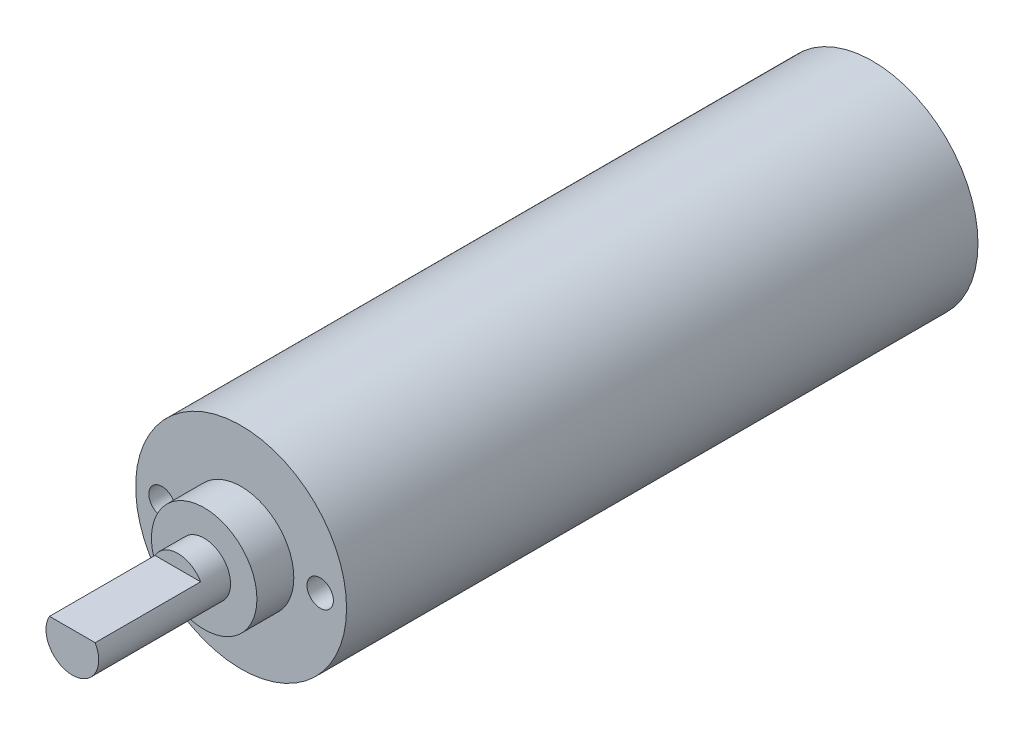
ISO-10303-21;
HEADER;
FILE_DESCRIPTION(('STEP AP214'),'2;1');
FILE_NAME('part.step','',(''),(''),'','','');
FILE_SCHEMA(('AUTOMOTIVE_DESIGN { 1 0 10303 214 1 1 1 1 }'));
ENDSEC;
DATA;
#1=APPLICATION_CONTEXT('core data for automotive mechanical design processes');
#2=APPLICATION_PROTOCOL_DEFINITION('international standard','automotive_design',2000,#1);
#3=PRODUCT_CONTEXT('',#1,'mechanical');
#4=PRODUCT('Part','Part','',(#3));
#5=PRODUCT_RELATED_PRODUCT_CATEGORY('part','',(#4));
#6=PRODUCT_DEFINITION_FORMATION('','',#4);
#7=PRODUCT_DEFINITION_CONTEXT('part definition',#1,'design');
#8=PRODUCT_DEFINITION('design','',#6,#7);
#9=PRODUCT_DEFINITION_SHAPE('','',#8);
#10=(LENGTH_UNIT() NAMED_UNIT(*) SI_UNIT(.MILLI.,.METRE.));
#11=(NAMED_UNIT(*) PLANE_ANGLE_UNIT() SI_UNIT($,.RADIAN.));
#12=(NAMED_UNIT(*) SI_UNIT($,.STERADIAN.) SOLID_ANGLE_UNIT());
#13=UNCERTAINTY_MEASURE_WITH_UNIT(LENGTH_MEASURE(1.E-05),#10,'distance_accuracy_value','');
#14=(GEOMETRIC_REPRESENTATION_CONTEXT(3) GLOBAL_UNCERTAINTY_ASSIGNED_CONTEXT((#13)) GLOBAL_UNIT_ASSIGNED_CONTEXT((#10,
#11,#12)) REPRESENTATION_CONTEXT('',''));
#15=CARTESIAN_POINT('',(0.,0.,0.));
#16=DIRECTION('',(0.,0.,1.));
#17=DIRECTION('',(1.,0.,0.));
#18=AXIS2_PLACEMENT_3D('',#15,#16,#17);
#19=CARTESIAN_POINT('',(0.,0.,60.7));
#20=DIRECTION('',(0.,0.,-1.));
#21=DIRECTION('',(-1.,0.,0.));
#22=AXIS2_PLACEMENT_3D('',#19,#20,#21);
#23=CYLINDRICAL_SURFACE('',#22,2.);
#24=CARTESIAN_POINT('',(0.,0.,50.7));
#25=DIRECTION('',(0.,0.,1.));
#26=DIRECTION('',(1.,0.,0.));
#27=AXIS2_PLACEMENT_3D('',#24,#25,#26);
#28=CIRCLE('',#27,2.);
#29=CARTESIAN_POINT('',(2.,0.,50.7));
#30=VERTEX_POINT('',#29);
#31=EDGE_CURVE('E69',#30,#30,#28,.T.);
#32=ORIENTED_EDGE('',*,*,#31,.T.);
#33=EDGE_LOOP('',(#32));
#34=FACE_BOUND('',#33,.T.);
#35=DIRECTION('',(0.,0.,-1.));
#36=VECTOR('',#35,1.);
#37=CARTESIAN_POINT('',(1.73205080756888,1.,60.7));
#38=LINE('',#37,#36);
#39=CARTESIAN_POINT('',(1.73205080756888,1.,60.7));
#40=VERTEX_POINT('',#39);
#41=CARTESIAN_POINT('',(1.73205080756888,1.,52.7));
#42=VERTEX_POINT('',#41);
#43=EDGE_CURVE('E61',#40,#42,#38,.T.);
#44=ORIENTED_EDGE('',*,*,#43,.F.);
#45=CARTESIAN_POINT('',(0.,0.,60.7));
#46=DIRECTION('',(0.,0.,1.));
#47=DIRECTION('',(1.,0.,0.));
#48=AXIS2_PLACEMENT_3D('',#45,#46,#47);
#49=CIRCLE('',#48,2.);
#50=CARTESIAN_POINT('',(-1.73205080756888,1.,60.7));
#51=VERTEX_POINT('',#50);
#52=EDGE_CURVE('E68',#51,#40,#49,.T.);
#53=ORIENTED_EDGE('',*,*,#52,.F.);
#54=DIRECTION('',(0.,0.,-1.));
#55=VECTOR('',#54,1.);
#56=CARTESIAN_POINT('',(-1.73205080756888,1.,60.7));
#57=LINE('',#56,#55);
#58=CARTESIAN_POINT('',(-1.73205080756888,1.,52.7));
#59=VERTEX_POINT('',#58);
#60=EDGE_CURVE('E47',#59,#51,#57,.F.);
#61=ORIENTED_EDGE('',*,*,#60,.F.);
#62=CARTESIAN_POINT('',(0.,0.,52.7));
#63=DIRECTION('',(0.,0.,1.));
#64=DIRECTION('',(1.,0.,0.));
#65=AXIS2_PLACEMENT_3D('',#62,#63,#64);
#66=CIRCLE('',#65,2.);
#67=EDGE_CURVE('E40',#42,#59,#66,.T.);
#68=ORIENTED_EDGE('',*,*,#67,.F.);
#69=EDGE_LOOP('',(#44,#53,#61,#68));
#70=FACE_BOUND('',#69,.T.);
#71=ADVANCED_FACE('F32',(#34,#70),#23,.T.);
#72=CARTESIAN_POINT('',(0.,0.,60.7));
#73=DIRECTION('',(0.,0.,1.));
#74=DIRECTION('',(1.,0.,0.));
#75=AXIS2_PLACEMENT_3D('',#72,#73,#74);
#76=PLANE('',#75);
#77=ORIENTED_EDGE('',*,*,#52,.T.);
#78=DIRECTION('',(-1.,0.,0.));
#79=VECTOR('',#78,1.);
#80=CARTESIAN_POINT('',(0.,1.,60.7));
#81=LINE('',#80,#79);
#82=EDGE_CURVE('E58',#40,#51,#81,.T.);
#83=ORIENTED_EDGE('',*,*,#82,.T.);
#84=EDGE_LOOP('',(#77,#83));
#85=FACE_BOUND('',#84,.T.);
#86=ADVANCED_FACE('F71',(#85),#76,.T.);
#87=CARTESIAN_POINT('',(0.,0.,47.9));
#88=DIRECTION('',(0.,0.,-1.));
#89=DIRECTION('',(-1.,0.,0.));
#90=AXIS2_PLACEMENT_3D('',#87,#88,#89);
#91=CYLINDRICAL_SURFACE('',#90,8.);
#92=CARTESIAN_POINT('',(0.,0.,47.9));
#93=DIRECTION('',(0.,0.,1.));
#94=DIRECTION('',(1.,0.,0.));
#95=AXIS2_PLACEMENT_3D('',#92,#93,#94);
#96=CIRCLE('',#95,8.);
#97=CARTESIAN_POINT('',(8.,0.,47.9));
#98=VERTEX_POINT('',#97);
#99=EDGE_CURVE('E65',#98,#98,#96,.T.);
#100=ORIENTED_EDGE('',*,*,#99,.F.);
#101=EDGE_LOOP('',(#100));
#102=FACE_BOUND('',#101,.T.);
#103=CARTESIAN_POINT('',(0.,0.,0.));
#104=DIRECTION('',(0.,0.,1.));
#105=DIRECTION('',(1.,0.,0.));
#106=AXIS2_PLACEMENT_3D('',#103,#104,#105);
#107=CIRCLE('',#106,8.);
#108=CARTESIAN_POINT('',(8.,0.,0.));
#109=VERTEX_POINT('',#108);
#110=EDGE_CURVE('E82',#109,#109,#107,.T.);
#111=ORIENTED_EDGE('',*,*,#110,.T.);
#112=EDGE_LOOP('',(#111));
#113=FACE_BOUND('',#112,.T.);
#114=ADVANCED_FACE('F34',(#102,#113),#91,.T.);
#115=CARTESIAN_POINT('',(0.,0.,47.9));
#116=DIRECTION('',(0.,0.,1.));
#117=DIRECTION('',(1.,0.,0.));
#118=AXIS2_PLACEMENT_3D('',#115,#116,#117);
#119=PLANE('',#118);
#120=CARTESIAN_POINT('',(-6.,0.,47.9));
#121=DIRECTION('',(0.,0.,1.));
#122=DIRECTION('',(1.,0.,0.));
#123=AXIS2_PLACEMENT_3D('',#120,#121,#122);
#124=CIRCLE('',#123,0.999999999999999);
#125=CARTESIAN_POINT('',(-5.,0.,47.9));
#126=VERTEX_POINT('',#125);
#127=EDGE_CURVE('E254',#126,#126,#124,.T.);
#128=ORIENTED_EDGE('',*,*,#127,.F.);
#129=EDGE_LOOP('',(#128));
#130=FACE_BOUND('',#129,.T.);
#131=CARTESIAN_POINT('',(6.,0.,47.9));
#132=DIRECTION('',(0.,0.,1.));
#133=DIRECTION('',(1.,0.,0.));
#134=AXIS2_PLACEMENT_3D('',#131,#132,#133);
#135=CIRCLE('',#134,1.);
#136=CARTESIAN_POINT('',(7.,0.,47.9));
#137=VERTEX_POINT('',#136);
#138=EDGE_CURVE('E248',#137,#137,#135,.T.);
#139=ORIENTED_EDGE('',*,*,#138,.F.);
#140=EDGE_LOOP('',(#139));
#141=FACE_BOUND('',#140,.T.);
#142=CARTESIAN_POINT('',(0.,0.,47.9));
#143=DIRECTION('',(0.,0.,1.));
#144=DIRECTION('',(1.,0.,0.));
#145=AXIS2_PLACEMENT_3D('',#142,#143,#144);
#146=CIRCLE('',#145,4.);
#147=CARTESIAN_POINT('',(4.,0.,47.9));
#148=VERTEX_POINT('',#147);
#149=EDGE_CURVE('E72',#148,#148,#146,.T.);
#150=ORIENTED_EDGE('',*,*,#149,.F.);
#151=EDGE_LOOP('',(#150));
#152=FACE_BOUND('',#151,.T.);
#153=ORIENTED_EDGE('',*,*,#99,.T.);
#154=EDGE_LOOP('',(#153));
#155=FACE_BOUND('',#154,.T.);
#156=ADVANCED_FACE('F93',(#130,#141,#152,#155),#119,.T.);
#157=CARTESIAN_POINT('',(0.,0.,0.));
#158=DIRECTION('',(0.,0.,1.));
#159=DIRECTION('',(1.,0.,0.));
#160=AXIS2_PLACEMENT_3D('',#157,#158,#159);
#161=PLANE('',#160);
#162=CARTESIAN_POINT('',(0.,0.,0.));
#163=DIRECTION('',(0.,0.,1.));
#164=DIRECTION('',(1.,0.,0.));
#165=AXIS2_PLACEMENT_3D('',#162,#163,#164);
#166=CIRCLE('',#165,4.);
#167=CARTESIAN_POINT('',(4.,0.,0.));
#168=VERTEX_POINT('',#167);
#169=EDGE_CURVE('E11',#168,#168,#166,.F.);
#170=ORIENTED_EDGE('',*,*,#169,.F.);
#171=EDGE_LOOP('',(#170));
#172=FACE_BOUND('',#171,.T.);
#173=ORIENTED_EDGE('',*,*,#110,.F.);
#174=EDGE_LOOP('',(#173));
#175=FACE_BOUND('',#174,.T.);
#176=ADVANCED_FACE('F90',(#172,#175),#161,.F.);
#177=CARTESIAN_POINT('',(0.,0.,50.7));
#178=DIRECTION('',(0.,0.,-1.));
#179=DIRECTION('',(-1.,0.,0.));
#180=AXIS2_PLACEMENT_3D('',#177,#178,#179);
#181=CYLINDRICAL_SURFACE('',#180,4.);
#182=CARTESIAN_POINT('',(0.,0.,50.7));
#183=DIRECTION('',(0.,0.,1.));
#184=DIRECTION('',(1.,0.,0.));
#185=AXIS2_PLACEMENT_3D('',#182,#183,#184);
#186=CIRCLE('',#185,4.);
#187=CARTESIAN_POINT('',(4.,0.,50.7));
#188=VERTEX_POINT('',#187);
#189=EDGE_CURVE('E75',#188,#188,#186,.T.);
#190=ORIENTED_EDGE('',*,*,#189,.F.);
#191=EDGE_LOOP('',(#190));
#192=FACE_BOUND('',#191,.T.);
#193=ORIENTED_EDGE('',*,*,#149,.T.);
#194=EDGE_LOOP('',(#193));
#195=FACE_BOUND('',#194,.T.);
#196=ADVANCED_FACE('F92',(#192,#195),#181,.T.);
#197=CARTESIAN_POINT('',(0.,0.,50.7));
#198=DIRECTION('',(0.,0.,1.));
#199=DIRECTION('',(1.,0.,0.));
#200=AXIS2_PLACEMENT_3D('',#197,#198,#199);
#201=PLANE('',#200);
#202=ORIENTED_EDGE('',*,*,#31,.F.);
#203=EDGE_LOOP('',(#202));
#204=FACE_BOUND('',#203,.T.);
#205=ORIENTED_EDGE('',*,*,#189,.T.);
#206=EDGE_LOOP('',(#205));
#207=FACE_BOUND('',#206,.T.);
#208=ADVANCED_FACE('F99',(#204,#207),#201,.T.);
#209=CARTESIAN_POINT('',(-2.,11.,52.7));
#210=DIRECTION('',(0.,0.,1.));
#211=DIRECTION('',(1.,0.,0.));
#212=AXIS2_PLACEMENT_3D('',#209,#210,#211);
#213=PLANE('',#212);
#214=ORIENTED_EDGE('',*,*,#67,.T.);
#215=DIRECTION('',(-1.,0.,0.));
#216=VECTOR('',#215,1.);
#217=CARTESIAN_POINT('',(-2.,1.,52.7));
#218=LINE('',#217,#216);
#219=EDGE_CURVE('E243',#42,#59,#218,.T.);
#220=ORIENTED_EDGE('',*,*,#219,.F.);
#221=EDGE_LOOP('',(#214,#220));
#222=FACE_BOUND('',#221,.T.);
#223=ADVANCED_FACE('F115',(#222),#213,.T.);
#224=CARTESIAN_POINT('',(0.,1.,0.));
#225=DIRECTION('',(0.,1.,0.));
#226=DIRECTION('',(0.,0.,1.));
#227=AXIS2_PLACEMENT_3D('',#224,#225,#226);
#228=PLANE('',#227);
#229=ORIENTED_EDGE('',*,*,#43,.T.);
#230=ORIENTED_EDGE('',*,*,#219,.T.);
#231=ORIENTED_EDGE('',*,*,#60,.T.);
#232=ORIENTED_EDGE('',*,*,#82,.F.);
#233=EDGE_LOOP('',(#229,#230,#231,#232));
#234=FACE_BOUND('',#233,.T.);
#235=ADVANCED_FACE('F60',(#234),#228,.T.);
#236=CARTESIAN_POINT('',(0.,0.,-1.5));
#237=DIRECTION('',(0.,0.,1.));
#238=DIRECTION('',(1.,0.,0.));
#239=AXIS2_PLACEMENT_3D('',#236,#237,#238);
#240=CYLINDRICAL_SURFACE('',#239,4.);
#241=CARTESIAN_POINT('',(0.,0.,-1.5));
#242=DIRECTION('',(0.,0.,-1.));
#243=DIRECTION('',(-1.,0.,0.));
#244=AXIS2_PLACEMENT_3D('',#241,#242,#243);
#245=CIRCLE('',#244,4.);
#246=CARTESIAN_POINT('',(-4.,0.,-1.5));
#247=VERTEX_POINT('',#246);
#248=EDGE_CURVE('E242',#247,#247,#245,.T.);
#249=ORIENTED_EDGE('',*,*,#248,.F.);
#250=EDGE_LOOP('',(#249));
#251=FACE_BOUND('',#250,.T.);
#252=ORIENTED_EDGE('',*,*,#169,.T.);
#253=EDGE_LOOP('',(#252));
#254=FACE_BOUND('',#253,.T.);
#255=ADVANCED_FACE('F193',(#251,#254),#240,.T.);
#256=CARTESIAN_POINT('',(0.,0.,-1.5));
#257=DIRECTION('',(0.,0.,-1.));
#258=DIRECTION('',(-1.,0.,0.));
#259=AXIS2_PLACEMENT_3D('',#256,#257,#258);
#260=PLANE('',#259);
#261=ORIENTED_EDGE('',*,*,#248,.T.);
#262=EDGE_LOOP('',(#261));
#263=FACE_BOUND('',#262,.T.);
#264=ADVANCED_FACE('F146',(#263),#260,.T.);
#265=CARTESIAN_POINT('',(6.,0.,41.9));
#266=DIRECTION('',(0.,0.,1.));
#267=DIRECTION('',(1.,0.,0.));
#268=AXIS2_PLACEMENT_3D('',#265,#266,#267);
#269=CYLINDRICAL_SURFACE('',#268,1.);
#270=CARTESIAN_POINT('',(6.,0.,41.9));
#271=DIRECTION('',(0.,0.,1.));
#272=DIRECTION('',(1.,0.,0.));
#273=AXIS2_PLACEMENT_3D('',#270,#271,#272);
#274=CIRCLE('',#273,1.);
#275=CARTESIAN_POINT('',(7.,0.,41.9));
#276=VERTEX_POINT('',#275);
#277=EDGE_CURVE('E244',#276,#276,#274,.T.);
#278=ORIENTED_EDGE('',*,*,#277,.F.);
#279=EDGE_LOOP('',(#278));
#280=FACE_BOUND('',#279,.T.);
#281=ORIENTED_EDGE('',*,*,#138,.T.);
#282=EDGE_LOOP('',(#281));
#283=FACE_BOUND('',#282,.T.);
#284=ADVANCED_FACE('F151',(#280,#283),#269,.F.);
#285=CARTESIAN_POINT('',(6.,0.,41.9));
#286=DIRECTION('',(0.,0.,1.));
#287=DIRECTION('',(1.,0.,0.));
#288=AXIS2_PLACEMENT_3D('',#285,#286,#287);
#289=PLANE('',#288);
#290=ORIENTED_EDGE('',*,*,#277,.T.);
#291=EDGE_LOOP('',(#290));
#292=FACE_BOUND('',#291,.T.);
#293=ADVANCED_FACE('F156',(#292),#289,.T.);
#294=CARTESIAN_POINT('',(-6.,0.,41.9));
#295=DIRECTION('',(0.,0.,1.));
#296=DIRECTION('',(1.,0.,0.));
#297=AXIS2_PLACEMENT_3D('',#294,#295,#296);
#298=CYLINDRICAL_SURFACE('',#297,0.999999999999999);
#299=CARTESIAN_POINT('',(-6.,0.,41.9));
#300=DIRECTION('',(0.,0.,1.));
#301=DIRECTION('',(1.,0.,0.));
#302=AXIS2_PLACEMENT_3D('',#299,#300,#301);
#303=CIRCLE('',#302,0.999999999999999);
#304=CARTESIAN_POINT('',(-5.,0.,41.9));
#305=VERTEX_POINT('',#304);
#306=EDGE_CURVE('E252',#305,#305,#303,.T.);
#307=ORIENTED_EDGE('',*,*,#306,.F.);
#308=EDGE_LOOP('',(#307));
#309=FACE_BOUND('',#308,.T.);
#310=ORIENTED_EDGE('',*,*,#127,.T.);
#311=EDGE_LOOP('',(#310));
#312=FACE_BOUND('',#311,.T.);
#313=ADVANCED_FACE('F166',(#309,#312),#298,.F.);
#314=CARTESIAN_POINT('',(-6.,0.,41.9));
#315=DIRECTION('',(0.,0.,1.));
#316=DIRECTION('',(1.,0.,0.));
#317=AXIS2_PLACEMENT_3D('',#314,#315,#316);
#318=PLANE('',#317);
#319=ORIENTED_EDGE('',*,*,#306,.T.);
#320=EDGE_LOOP('',(#319));
#321=FACE_BOUND('',#320,.T.);
#322=ADVANCED_FACE('F176',(#321),#318,.T.);
#323=CLOSED_SHELL('',(#71,#86,#114,#156,#176,#196,#208,#223,#235,#255,#264,#284,#293,#313,#322));
#324=MANIFOLD_SOLID_BREP('B2',#323);
#325=ADVANCED_BREP_SHAPE_REPRESENTATION('',(#18,#324),#14);
#326=SHAPE_DEFINITION_REPRESENTATION(#9,#325);
ENDSEC;
END-ISO-10303-21;
